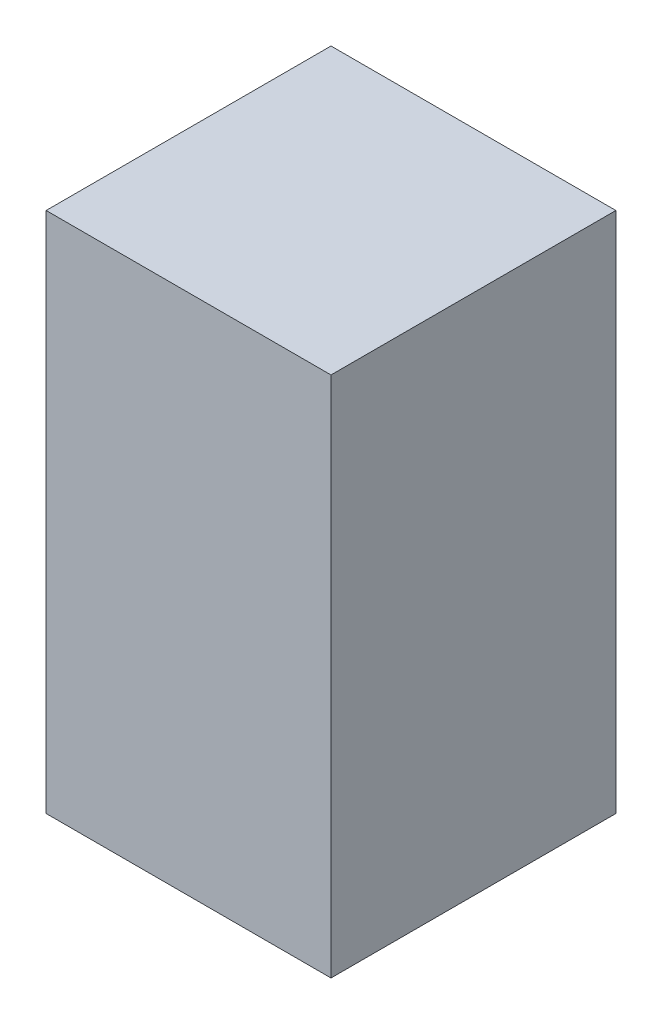
ISO-10303-21;
HEADER;
FILE_DESCRIPTION(('STEP AP214'),'2;1');
FILE_NAME('part.step','',(''),(''),'','','');
FILE_SCHEMA(('AUTOMOTIVE_DESIGN { 1 0 10303 214 1 1 1 1 }'));
ENDSEC;
DATA;
#1=APPLICATION_CONTEXT('core data for automotive mechanical design processes');
#2=APPLICATION_PROTOCOL_DEFINITION('international standard','automotive_design',2000,#1);
#3=PRODUCT_CONTEXT('',#1,'mechanical');
#4=PRODUCT('Part','Part','',(#3));
#5=PRODUCT_RELATED_PRODUCT_CATEGORY('part','',(#4));
#6=PRODUCT_DEFINITION_FORMATION('','',#4);
#7=PRODUCT_DEFINITION_CONTEXT('part definition',#1,'design');
#8=PRODUCT_DEFINITION('design','',#6,#7);
#9=PRODUCT_DEFINITION_SHAPE('','',#8);
#10=(LENGTH_UNIT() NAMED_UNIT(*) SI_UNIT(.MILLI.,.METRE.));
#11=(NAMED_UNIT(*) PLANE_ANGLE_UNIT() SI_UNIT($,.RADIAN.));
#12=(NAMED_UNIT(*) SI_UNIT($,.STERADIAN.) SOLID_ANGLE_UNIT());
#13=UNCERTAINTY_MEASURE_WITH_UNIT(LENGTH_MEASURE(1.E-05),#10,'distance_accuracy_value','');
#14=(GEOMETRIC_REPRESENTATION_CONTEXT(3) GLOBAL_UNCERTAINTY_ASSIGNED_CONTEXT((#13)) GLOBAL_UNIT_ASSIGNED_CONTEXT((#10,
#11,#12)) REPRESENTATION_CONTEXT('',''));
#15=CARTESIAN_POINT('',(0.,0.,0.));
#16=DIRECTION('',(0.,0.,1.));
#17=DIRECTION('',(1.,0.,0.));
#18=AXIS2_PLACEMENT_3D('',#15,#16,#17);
#19=CARTESIAN_POINT('',(30.,110.,30.));
#20=DIRECTION('',(-1.,0.,0.));
#21=DIRECTION('',(0.,0.,1.));
#22=AXIS2_PLACEMENT_3D('',#19,#20,#21);
#23=PLANE('',#22);
#24=DIRECTION('',(0.,0.,-1.));
#25=VECTOR('',#24,1.);
#26=CARTESIAN_POINT('',(30.,0.,30.));
#27=LINE('',#26,#25);
#28=CARTESIAN_POINT('',(30.,0.,30.));
#29=VERTEX_POINT('',#28);
#30=CARTESIAN_POINT('',(30.,0.,-30.));
#31=VERTEX_POINT('',#30);
#32=EDGE_CURVE('E96',#29,#31,#27,.T.);
#33=ORIENTED_EDGE('',*,*,#32,.T.);
#34=DIRECTION('',(0.,-1.,0.));
#35=VECTOR('',#34,1.);
#36=CARTESIAN_POINT('',(30.,110.,-30.));
#37=LINE('',#36,#35);
#38=CARTESIAN_POINT('',(30.,110.,-30.));
#39=VERTEX_POINT('',#38);
#40=EDGE_CURVE('E11',#39,#31,#37,.T.);
#41=ORIENTED_EDGE('',*,*,#40,.F.);
#42=DIRECTION('',(0.,0.,-1.));
#43=VECTOR('',#42,1.);
#44=CARTESIAN_POINT('',(30.,110.,30.));
#45=LINE('',#44,#43);
#46=CARTESIAN_POINT('',(30.,110.,30.));
#47=VERTEX_POINT('',#46);
#48=EDGE_CURVE('E84',#47,#39,#45,.T.);
#49=ORIENTED_EDGE('',*,*,#48,.F.);
#50=DIRECTION('',(0.,-1.,0.));
#51=VECTOR('',#50,1.);
#52=CARTESIAN_POINT('',(30.,110.,30.));
#53=LINE('',#52,#51);
#54=EDGE_CURVE('E92',#47,#29,#53,.T.);
#55=ORIENTED_EDGE('',*,*,#54,.T.);
#56=EDGE_LOOP('',(#33,#41,#49,#55));
#57=FACE_BOUND('',#56,.T.);
#58=ADVANCED_FACE('F33',(#57),#23,.F.);
#59=CARTESIAN_POINT('',(-30.,110.,-30.));
#60=DIRECTION('',(0.,0.,1.));
#61=DIRECTION('',(1.,0.,0.));
#62=AXIS2_PLACEMENT_3D('',#59,#60,#61);
#63=PLANE('',#62);
#64=DIRECTION('',(-1.,0.,0.));
#65=VECTOR('',#64,1.);
#66=CARTESIAN_POINT('',(-30.,0.,-30.));
#67=LINE('',#66,#65);
#68=CARTESIAN_POINT('',(-30.,0.,-30.));
#69=VERTEX_POINT('',#68);
#70=EDGE_CURVE('E88',#31,#69,#67,.T.);
#71=ORIENTED_EDGE('',*,*,#70,.T.);
#72=DIRECTION('',(0.,-1.,0.));
#73=VECTOR('',#72,1.);
#74=CARTESIAN_POINT('',(-30.,110.,-30.));
#75=LINE('',#74,#73);
#76=CARTESIAN_POINT('',(-30.,110.,-30.));
#77=VERTEX_POINT('',#76);
#78=EDGE_CURVE('E41',#77,#69,#75,.T.);
#79=ORIENTED_EDGE('',*,*,#78,.F.);
#80=DIRECTION('',(-1.,0.,0.));
#81=VECTOR('',#80,1.);
#82=CARTESIAN_POINT('',(-30.,110.,-30.));
#83=LINE('',#82,#81);
#84=EDGE_CURVE('E79',#39,#77,#83,.T.);
#85=ORIENTED_EDGE('',*,*,#84,.F.);
#86=ORIENTED_EDGE('',*,*,#40,.T.);
#87=EDGE_LOOP('',(#71,#79,#85,#86));
#88=FACE_BOUND('',#87,.T.);
#89=ADVANCED_FACE('F87',(#88),#63,.F.);
#90=CARTESIAN_POINT('',(-30.,110.,30.));
#91=DIRECTION('',(1.,0.,0.));
#92=DIRECTION('',(0.,0.,-1.));
#93=AXIS2_PLACEMENT_3D('',#90,#91,#92);
#94=PLANE('',#93);
#95=DIRECTION('',(0.,0.,1.));
#96=VECTOR('',#95,1.);
#97=CARTESIAN_POINT('',(-30.,0.,30.));
#98=LINE('',#97,#96);
#99=CARTESIAN_POINT('',(-30.,0.,30.));
#100=VERTEX_POINT('',#99);
#101=EDGE_CURVE('E66',#69,#100,#98,.T.);
#102=ORIENTED_EDGE('',*,*,#101,.T.);
#103=DIRECTION('',(0.,-1.,0.));
#104=VECTOR('',#103,1.);
#105=CARTESIAN_POINT('',(-30.,110.,30.));
#106=LINE('',#105,#104);
#107=CARTESIAN_POINT('',(-30.,110.,30.));
#108=VERTEX_POINT('',#107);
#109=EDGE_CURVE('E89',#108,#100,#106,.T.);
#110=ORIENTED_EDGE('',*,*,#109,.F.);
#111=DIRECTION('',(0.,0.,1.));
#112=VECTOR('',#111,1.);
#113=CARTESIAN_POINT('',(-30.,110.,30.));
#114=LINE('',#113,#112);
#115=EDGE_CURVE('E82',#77,#108,#114,.T.);
#116=ORIENTED_EDGE('',*,*,#115,.F.);
#117=ORIENTED_EDGE('',*,*,#78,.T.);
#118=EDGE_LOOP('',(#102,#110,#116,#117));
#119=FACE_BOUND('',#118,.T.);
#120=ADVANCED_FACE('F90',(#119),#94,.F.);
#121=CARTESIAN_POINT('',(-30.,110.,30.));
#122=DIRECTION('',(0.,0.,-1.));
#123=DIRECTION('',(-1.,0.,0.));
#124=AXIS2_PLACEMENT_3D('',#121,#122,#123);
#125=PLANE('',#124);
#126=DIRECTION('',(1.,0.,0.));
#127=VECTOR('',#126,1.);
#128=CARTESIAN_POINT('',(-30.,0.,30.));
#129=LINE('',#128,#127);
#130=EDGE_CURVE('E72',#100,#29,#129,.T.);
#131=ORIENTED_EDGE('',*,*,#130,.T.);
#132=ORIENTED_EDGE('',*,*,#54,.F.);
#133=DIRECTION('',(1.,0.,0.));
#134=VECTOR('',#133,1.);
#135=CARTESIAN_POINT('',(-30.,110.,30.));
#136=LINE('',#135,#134);
#137=EDGE_CURVE('E49',#108,#47,#136,.T.);
#138=ORIENTED_EDGE('',*,*,#137,.F.);
#139=ORIENTED_EDGE('',*,*,#109,.T.);
#140=EDGE_LOOP('',(#131,#132,#138,#139));
#141=FACE_BOUND('',#140,.T.);
#142=ADVANCED_FACE('F103',(#141),#125,.F.);
#143=CARTESIAN_POINT('',(0.,110.,0.));
#144=DIRECTION('',(0.,-1.,0.));
#145=DIRECTION('',(0.,0.,-1.));
#146=AXIS2_PLACEMENT_3D('',#143,#144,#145);
#147=PLANE('',#146);
#148=ORIENTED_EDGE('',*,*,#48,.T.);
#149=ORIENTED_EDGE('',*,*,#84,.T.);
#150=ORIENTED_EDGE('',*,*,#115,.T.);
#151=ORIENTED_EDGE('',*,*,#137,.T.);
#152=EDGE_LOOP('',(#148,#149,#150,#151));
#153=FACE_BOUND('',#152,.T.);
#154=ADVANCED_FACE('F80',(#153),#147,.F.);
#155=CARTESIAN_POINT('',(0.,0.,0.));
#156=DIRECTION('',(0.,-1.,0.));
#157=DIRECTION('',(0.,0.,-1.));
#158=AXIS2_PLACEMENT_3D('',#155,#156,#157);
#159=PLANE('',#158);
#160=ORIENTED_EDGE('',*,*,#32,.F.);
#161=ORIENTED_EDGE('',*,*,#130,.F.);
#162=ORIENTED_EDGE('',*,*,#101,.F.);
#163=ORIENTED_EDGE('',*,*,#70,.F.);
#164=EDGE_LOOP('',(#160,#161,#162,#163));
#165=FACE_BOUND('',#164,.T.);
#166=ADVANCED_FACE('F106',(#165),#159,.T.);
#167=CLOSED_SHELL('',(#58,#89,#120,#142,#154,#166));
#168=MANIFOLD_SOLID_BREP('B2',#167);
#169=ADVANCED_BREP_SHAPE_REPRESENTATION('',(#18,#168),#14);
#170=SHAPE_DEFINITION_REPRESENTATION(#9,#169);
ENDSEC;
END-ISO-10303-21;
